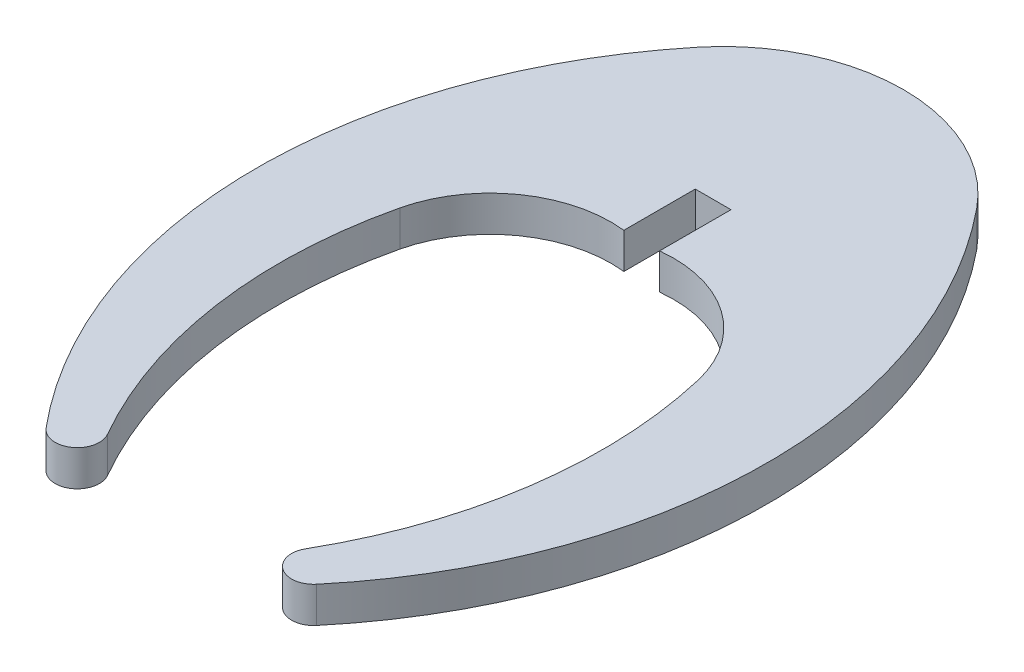
ISO-10303-21;
HEADER;
FILE_DESCRIPTION(('STEP AP214'),'2;1');
FILE_NAME('part.step','',(''),(''),'','','');
FILE_SCHEMA(('AUTOMOTIVE_DESIGN { 1 0 10303 214 1 1 1 1 }'));
ENDSEC;
DATA;
#1=APPLICATION_CONTEXT('core data for automotive mechanical design processes');
#2=APPLICATION_PROTOCOL_DEFINITION('international standard','automotive_design',2000,#1);
#3=PRODUCT_CONTEXT('',#1,'mechanical');
#4=PRODUCT('Part','Part','',(#3));
#5=PRODUCT_RELATED_PRODUCT_CATEGORY('part','',(#4));
#6=PRODUCT_DEFINITION_FORMATION('','',#4);
#7=PRODUCT_DEFINITION_CONTEXT('part definition',#1,'design');
#8=PRODUCT_DEFINITION('design','',#6,#7);
#9=PRODUCT_DEFINITION_SHAPE('','',#8);
#10=(LENGTH_UNIT() NAMED_UNIT(*) SI_UNIT(.MILLI.,.METRE.));
#11=(NAMED_UNIT(*) PLANE_ANGLE_UNIT() SI_UNIT($,.RADIAN.));
#12=(NAMED_UNIT(*) SI_UNIT($,.STERADIAN.) SOLID_ANGLE_UNIT());
#13=UNCERTAINTY_MEASURE_WITH_UNIT(LENGTH_MEASURE(1.E-05),#10,'distance_accuracy_value','');
#14=(GEOMETRIC_REPRESENTATION_CONTEXT(3) GLOBAL_UNCERTAINTY_ASSIGNED_CONTEXT((#13)) GLOBAL_UNIT_ASSIGNED_CONTEXT((#10,
#11,#12)) REPRESENTATION_CONTEXT('',''));
#15=CARTESIAN_POINT('',(0.,0.,0.));
#16=DIRECTION('',(0.,0.,1.));
#17=DIRECTION('',(1.,0.,0.));
#18=AXIS2_PLACEMENT_3D('',#15,#16,#17);
#19=CARTESIAN_POINT('',(-41923.310631,3.,-18307.5707099999));
#20=DIRECTION('',(-0.999999951477443,0.,0.000311520644661001));
#21=DIRECTION('',(0.000311520644661001,0.,0.999999951477443));
#22=AXIS2_PLACEMENT_3D('',#19,#20,#21);
#23=PLANE('',#22);
#24=DIRECTION('',(-0.000311520644661001,0.,-0.999999951477443));
#25=VECTOR('',#24,1.);
#26=CARTESIAN_POINT('',(-41923.310631,0.,-18307.5707099999));
#27=LINE('',#26,#25);
#28=CARTESIAN_POINT('',(-41923.310631,0.,-18307.5707099999));
#29=VERTEX_POINT('',#28);
#30=CARTESIAN_POINT('',(-41923.3125,0.,-18313.570312));
#31=VERTEX_POINT('',#30);
#32=EDGE_CURVE('E155',#29,#31,#27,.T.);
#33=ORIENTED_EDGE('',*,*,#32,.T.);
#34=DIRECTION('',(0.,-1.,0.));
#35=VECTOR('',#34,1.);
#36=CARTESIAN_POINT('',(-41923.3125,3.,-18313.570312));
#37=LINE('',#36,#35);
#38=CARTESIAN_POINT('',(-41923.3125,3.,-18313.570312));
#39=VERTEX_POINT('',#38);
#40=EDGE_CURVE('E11',#39,#31,#37,.T.);
#41=ORIENTED_EDGE('',*,*,#40,.F.);
#42=DIRECTION('',(-0.000311520644661001,0.,-0.999999951477443));
#43=VECTOR('',#42,1.);
#44=CARTESIAN_POINT('',(-41923.310631,3.,-18307.5707099999));
#45=LINE('',#44,#43);
#46=CARTESIAN_POINT('',(-41923.310631,3.,-18307.5707099999));
#47=VERTEX_POINT('',#46);
#48=EDGE_CURVE('E177',#47,#39,#45,.T.);
#49=ORIENTED_EDGE('',*,*,#48,.F.);
#50=DIRECTION('',(0.,-1.,0.));
#51=VECTOR('',#50,1.);
#52=CARTESIAN_POINT('',(-41923.310631,3.,-18307.5707099999));
#53=LINE('',#52,#51);
#54=EDGE_CURVE('E151',#47,#29,#53,.T.);
#55=ORIENTED_EDGE('',*,*,#54,.T.);
#56=EDGE_LOOP('',(#33,#41,#49,#55));
#57=FACE_BOUND('',#56,.T.);
#58=ADVANCED_FACE('F35',(#57),#23,.F.);
#59=CARTESIAN_POINT('',(-41923.3125,3.,-18313.570312));
#60=DIRECTION('',(0.000650153362123656,0.,-0.999999788650281));
#61=DIRECTION('',(-0.999999788650281,0.,-0.000650153362123656));
#62=AXIS2_PLACEMENT_3D('',#59,#60,#61);
#63=PLANE('',#62);
#64=DIRECTION('',(0.99999978865028,0.,0.000650153362123656));
#65=VECTOR('',#64,1.);
#66=CARTESIAN_POINT('',(-41923.3125,0.,-18313.570312));
#67=LINE('',#66,#65);
#68=CARTESIAN_POINT('',(-41920.308594,0.,-18313.568359));
#69=VERTEX_POINT('',#68);
#70=EDGE_CURVE('E158',#31,#69,#67,.T.);
#71=ORIENTED_EDGE('',*,*,#70,.T.);
#72=DIRECTION('',(0.,-1.,0.));
#73=VECTOR('',#72,1.);
#74=CARTESIAN_POINT('',(-41920.308594,3.,-18313.568359));
#75=LINE('',#74,#73);
#76=CARTESIAN_POINT('',(-41920.308594,3.,-18313.568359));
#77=VERTEX_POINT('',#76);
#78=EDGE_CURVE('E43',#77,#69,#75,.T.);
#79=ORIENTED_EDGE('',*,*,#78,.F.);
#80=DIRECTION('',(0.99999978865028,0.,0.000650153362123656));
#81=VECTOR('',#80,1.);
#82=CARTESIAN_POINT('',(-41923.3125,3.,-18313.570312));
#83=LINE('',#82,#81);
#84=EDGE_CURVE('E106',#39,#77,#83,.T.);
#85=ORIENTED_EDGE('',*,*,#84,.F.);
#86=ORIENTED_EDGE('',*,*,#40,.T.);
#87=EDGE_LOOP('',(#71,#79,#85,#86));
#88=FACE_BOUND('',#87,.T.);
#89=ADVANCED_FACE('F255',(#88),#63,.F.);
#90=CARTESIAN_POINT('',(-41920.308594,3.,-18313.568359));
#91=DIRECTION('',(0.999999787685049,0.,0.00065163629143758));
#92=DIRECTION('',(0.00065163629143758,0.,-0.999999787685049));
#93=AXIS2_PLACEMENT_3D('',#90,#91,#92);
#94=PLANE('',#93);
#95=DIRECTION('',(-0.00065163629143758,0.,0.999999787685049));
#96=VECTOR('',#95,1.);
#97=CARTESIAN_POINT('',(-41920.308594,0.,-18313.568359));
#98=LINE('',#97,#96);
#99=CARTESIAN_POINT('',(-41920.3125,0.,-18307.574219));
#100=VERTEX_POINT('',#99);
#101=EDGE_CURVE('E160',#69,#100,#98,.T.);
#102=ORIENTED_EDGE('',*,*,#101,.T.);
#103=DIRECTION('',(0.,-1.,0.));
#104=VECTOR('',#103,1.);
#105=CARTESIAN_POINT('',(-41920.3125,3.,-18307.574219));
#106=LINE('',#105,#104);
#107=CARTESIAN_POINT('',(-41920.3125,3.,-18307.574219));
#108=VERTEX_POINT('',#107);
#109=EDGE_CURVE('E196',#108,#100,#106,.T.);
#110=ORIENTED_EDGE('',*,*,#109,.F.);
#111=DIRECTION('',(-0.00065163629143758,0.,0.999999787685049));
#112=VECTOR('',#111,1.);
#113=CARTESIAN_POINT('',(-41920.308594,3.,-18313.568359));
#114=LINE('',#113,#112);
#115=EDGE_CURVE('E204',#77,#108,#114,.T.);
#116=ORIENTED_EDGE('',*,*,#115,.F.);
#117=ORIENTED_EDGE('',*,*,#78,.T.);
#118=EDGE_LOOP('',(#102,#110,#116,#117));
#119=FACE_BOUND('',#118,.T.);
#120=ADVANCED_FACE('F202',(#119),#94,.F.);
#121=CARTESIAN_POINT('',(-41919.1911014166,3.,-18297.4693434059));
#122=DIRECTION('',(0.,-1.,0.));
#123=DIRECTION('',(0.,0.,-1.));
#124=AXIS2_PLACEMENT_3D('',#121,#122,#123);
#125=CYLINDRICAL_SURFACE('',#124,10.1669093413984);
#126=CARTESIAN_POINT('',(-41919.1911014166,0.,-18297.4693434059));
#127=DIRECTION('',(0.,-1.,0.));
#128=DIRECTION('',(0.,0.,1.));
#129=AXIS2_PLACEMENT_3D('',#126,#127,#128);
#130=CIRCLE('',#129,10.1669093413984);
#131=CARTESIAN_POINT('',(-41909.2904880001,0.,-18299.781031));
#132=VERTEX_POINT('',#131);
#133=EDGE_CURVE('E162',#100,#132,#130,.T.);
#134=ORIENTED_EDGE('',*,*,#133,.T.);
#135=DIRECTION('',(0.,-1.,0.));
#136=VECTOR('',#135,1.);
#137=CARTESIAN_POINT('',(-41909.2904880001,3.,-18299.781031));
#138=LINE('',#137,#136);
#139=CARTESIAN_POINT('',(-41909.2904880001,3.,-18299.781031));
#140=VERTEX_POINT('',#139);
#141=EDGE_CURVE('E193',#140,#132,#138,.T.);
#142=ORIENTED_EDGE('',*,*,#141,.F.);
#143=CARTESIAN_POINT('',(-41919.1911014166,3.,-18297.4693434059));
#144=DIRECTION('',(0.,-1.,0.));
#145=DIRECTION('',(0.,0.,1.));
#146=AXIS2_PLACEMENT_3D('',#143,#144,#145);
#147=CIRCLE('',#146,10.1669093413984);
#148=EDGE_CURVE('E222',#108,#140,#147,.T.);
#149=ORIENTED_EDGE('',*,*,#148,.F.);
#150=ORIENTED_EDGE('',*,*,#109,.T.);
#151=EDGE_LOOP('',(#134,#142,#149,#150));
#152=FACE_BOUND('',#151,.T.);
#153=ADVANCED_FACE('F213',(#152),#125,.F.);
#154=CARTESIAN_POINT('',(-41947.8406722226,3.,-18290.7599826209));
#155=DIRECTION('',(0.,-1.,0.));
#156=DIRECTION('',(0.,0.,-1.));
#157=AXIS2_PLACEMENT_3D('',#154,#155,#156);
#158=CYLINDRICAL_SURFACE('',#157,39.5916154942953);
#159=CARTESIAN_POINT('',(-41947.8406722226,0.,-18290.7599826209));
#160=DIRECTION('',(0.,-1.,0.));
#161=DIRECTION('',(0.,0.,1.));
#162=AXIS2_PLACEMENT_3D('',#159,#160,#161);
#163=CIRCLE('',#162,39.5916154942953);
#164=CARTESIAN_POINT('',(-41913.5091370001,0.,-18271.040913));
#165=VERTEX_POINT('',#164);
#166=EDGE_CURVE('E164',#132,#165,#163,.T.);
#167=ORIENTED_EDGE('',*,*,#166,.T.);
#168=DIRECTION('',(0.,-1.,0.));
#169=VECTOR('',#168,1.);
#170=CARTESIAN_POINT('',(-41913.5091370001,3.,-18271.040913));
#171=LINE('',#170,#169);
#172=CARTESIAN_POINT('',(-41913.5091370001,3.,-18271.040913));
#173=VERTEX_POINT('',#172);
#174=EDGE_CURVE('E190',#173,#165,#171,.T.);
#175=ORIENTED_EDGE('',*,*,#174,.F.);
#176=CARTESIAN_POINT('',(-41947.8406722226,3.,-18290.7599826209));
#177=DIRECTION('',(0.,-1.,0.));
#178=DIRECTION('',(0.,0.,1.));
#179=AXIS2_PLACEMENT_3D('',#176,#177,#178);
#180=CIRCLE('',#179,39.5916154942953);
#181=EDGE_CURVE('E219',#140,#173,#180,.T.);
#182=ORIENTED_EDGE('',*,*,#181,.F.);
#183=ORIENTED_EDGE('',*,*,#141,.T.);
#184=EDGE_LOOP('',(#167,#175,#182,#183));
#185=FACE_BOUND('',#184,.T.);
#186=ADVANCED_FACE('F217',(#185),#158,.F.);
#187=CARTESIAN_POINT('',(-41911.8973565505,3.,-18270.1164332687));
#188=DIRECTION('',(0.,-1.,0.));
#189=DIRECTION('',(0.,0.,-1.));
#190=AXIS2_PLACEMENT_3D('',#187,#188,#189);
#191=CYLINDRICAL_SURFACE('',#190,1.85809014620008);
#192=CARTESIAN_POINT('',(-41911.8973565505,0.,-18270.1164332687));
#193=DIRECTION('',(0.,1.,0.));
#194=DIRECTION('',(0.,0.,1.));
#195=AXIS2_PLACEMENT_3D('',#192,#193,#194);
#196=CIRCLE('',#195,1.85809014620008);
#197=CARTESIAN_POINT('',(-41910.473192,0.,-18268.923012));
#198=VERTEX_POINT('',#197);
#199=EDGE_CURVE('E166',#165,#198,#196,.T.);
#200=ORIENTED_EDGE('',*,*,#199,.T.);
#201=DIRECTION('',(0.,-1.,0.));
#202=VECTOR('',#201,1.);
#203=CARTESIAN_POINT('',(-41910.473192,3.,-18268.923012));
#204=LINE('',#203,#202);
#205=CARTESIAN_POINT('',(-41910.473192,3.,-18268.923012));
#206=VERTEX_POINT('',#205);
#207=EDGE_CURVE('E187',#206,#198,#204,.T.);
#208=ORIENTED_EDGE('',*,*,#207,.F.);
#209=CARTESIAN_POINT('',(-41911.8973565505,3.,-18270.1164332687));
#210=DIRECTION('',(0.,1.,0.));
#211=DIRECTION('',(0.,0.,1.));
#212=AXIS2_PLACEMENT_3D('',#209,#210,#211);
#213=CIRCLE('',#212,1.85809014620008);
#214=EDGE_CURVE('E221',#173,#206,#213,.T.);
#215=ORIENTED_EDGE('',*,*,#214,.F.);
#216=ORIENTED_EDGE('',*,*,#174,.T.);
#217=EDGE_LOOP('',(#200,#208,#215,#216));
#218=FACE_BOUND('',#217,.T.);
#219=ADVANCED_FACE('F268',(#218),#191,.T.);
#220=CARTESIAN_POINT('',(-41943.5859328936,3.,-18296.6861208578));
#221=DIRECTION('',(0.,-1.,0.));
#222=DIRECTION('',(0.,0.,-1.));
#223=AXIS2_PLACEMENT_3D('',#220,#221,#222);
#224=CYLINDRICAL_SURFACE('',#223,43.2116167590956);
#225=CARTESIAN_POINT('',(-41943.5859328936,0.,-18296.6861208578));
#226=DIRECTION('',(0.,1.,0.));
#227=DIRECTION('',(0.,0.,1.));
#228=AXIS2_PLACEMENT_3D('',#225,#226,#227);
#229=CIRCLE('',#228,43.2116167590956);
#230=CARTESIAN_POINT('',(-41910.079274,0.,-18323.972521));
#231=VERTEX_POINT('',#230);
#232=EDGE_CURVE('E168',#198,#231,#229,.T.);
#233=ORIENTED_EDGE('',*,*,#232,.T.);
#234=DIRECTION('',(0.,-1.,0.));
#235=VECTOR('',#234,1.);
#236=CARTESIAN_POINT('',(-41910.079274,3.,-18323.972521));
#237=LINE('',#236,#235);
#238=CARTESIAN_POINT('',(-41910.079274,3.,-18323.972521));
#239=VERTEX_POINT('',#238);
#240=EDGE_CURVE('E184',#239,#231,#237,.T.);
#241=ORIENTED_EDGE('',*,*,#240,.F.);
#242=CARTESIAN_POINT('',(-41943.5859328936,3.,-18296.6861208578));
#243=DIRECTION('',(0.,1.,0.));
#244=DIRECTION('',(0.,0.,1.));
#245=AXIS2_PLACEMENT_3D('',#242,#243,#244);
#246=CIRCLE('',#245,43.2116167590956);
#247=EDGE_CURVE('E224',#206,#239,#246,.T.);
#248=ORIENTED_EDGE('',*,*,#247,.F.);
#249=ORIENTED_EDGE('',*,*,#207,.T.);
#250=EDGE_LOOP('',(#233,#241,#248,#249));
#251=FACE_BOUND('',#250,.T.);
#252=ADVANCED_FACE('F271',(#251),#224,.T.);
#253=CARTESIAN_POINT('',(-41921.8088364548,3.,-18314.4179691375));
#254=DIRECTION('',(0.,-1.,0.));
#255=DIRECTION('',(0.,0.,-1.));
#256=AXIS2_PLACEMENT_3D('',#253,#254,#255);
#257=CYLINDRICAL_SURFACE('',#256,15.1285193154019);
#258=CARTESIAN_POINT('',(-41921.8088364548,0.,-18314.4179691375));
#259=DIRECTION('',(0.,1.,0.));
#260=DIRECTION('',(0.,0.,1.));
#261=AXIS2_PLACEMENT_3D('',#258,#259,#260);
#262=CIRCLE('',#261,15.1285193154019);
#263=CARTESIAN_POINT('',(-41933.528271,0.,-18323.984941));
#264=VERTEX_POINT('',#263);
#265=EDGE_CURVE('E170',#231,#264,#262,.T.);
#266=ORIENTED_EDGE('',*,*,#265,.T.);
#267=DIRECTION('',(0.,-1.,0.));
#268=VECTOR('',#267,1.);
#269=CARTESIAN_POINT('',(-41933.528271,3.,-18323.984941));
#270=LINE('',#269,#268);
#271=CARTESIAN_POINT('',(-41933.528271,3.,-18323.984941));
#272=VERTEX_POINT('',#271);
#273=EDGE_CURVE('E181',#272,#264,#270,.T.);
#274=ORIENTED_EDGE('',*,*,#273,.F.);
#275=CARTESIAN_POINT('',(-41921.8088364548,3.,-18314.4179691375));
#276=DIRECTION('',(0.,1.,0.));
#277=DIRECTION('',(0.,0.,1.));
#278=AXIS2_PLACEMENT_3D('',#275,#276,#277);
#279=CIRCLE('',#278,15.1285193154019);
#280=EDGE_CURVE('E230',#239,#272,#279,.T.);
#281=ORIENTED_EDGE('',*,*,#280,.F.);
#282=ORIENTED_EDGE('',*,*,#240,.T.);
#283=EDGE_LOOP('',(#266,#274,#281,#282));
#284=FACE_BOUND('',#283,.T.);
#285=ADVANCED_FACE('F236',(#284),#257,.T.);
#286=CARTESIAN_POINT('',(-41900.0507753076,3.,-18296.6631295691));
#287=DIRECTION('',(0.,-1.,0.));
#288=DIRECTION('',(0.,0.,-1.));
#289=AXIS2_PLACEMENT_3D('',#286,#287,#288);
#290=CYLINDRICAL_SURFACE('',#289,43.2113885184947);
#291=CARTESIAN_POINT('',(-41900.0507753076,0.,-18296.6631295691));
#292=DIRECTION('',(0.,1.,0.));
#293=DIRECTION('',(0.,0.,1.));
#294=AXIS2_PLACEMENT_3D('',#291,#292,#293);
#295=CIRCLE('',#294,43.2113885184947);
#296=CARTESIAN_POINT('',(-41933.192194,0.,-18268.9346159999));
#297=VERTEX_POINT('',#296);
#298=EDGE_CURVE('E172',#264,#297,#295,.T.);
#299=ORIENTED_EDGE('',*,*,#298,.T.);
#300=DIRECTION('',(0.,-1.,0.));
#301=VECTOR('',#300,1.);
#302=CARTESIAN_POINT('',(-41933.192194,3.,-18268.9346159999));
#303=LINE('',#302,#301);
#304=CARTESIAN_POINT('',(-41933.192194,3.,-18268.9346159999));
#305=VERTEX_POINT('',#304);
#306=EDGE_CURVE('E146',#305,#297,#303,.T.);
#307=ORIENTED_EDGE('',*,*,#306,.F.);
#308=CARTESIAN_POINT('',(-41900.0507753076,3.,-18296.6631295691));
#309=DIRECTION('',(0.,1.,0.));
#310=DIRECTION('',(0.,0.,1.));
#311=AXIS2_PLACEMENT_3D('',#308,#309,#310);
#312=CIRCLE('',#311,43.2113885184947);
#313=EDGE_CURVE('E137',#272,#305,#312,.T.);
#314=ORIENTED_EDGE('',*,*,#313,.F.);
#315=ORIENTED_EDGE('',*,*,#273,.T.);
#316=EDGE_LOOP('',(#299,#307,#314,#315));
#317=FACE_BOUND('',#316,.T.);
#318=ADVANCED_FACE('F240',(#317),#290,.T.);
#319=CARTESIAN_POINT('',(-41931.7650409498,3.,-18270.1254058329));
#320=DIRECTION('',(0.,-1.,0.));
#321=DIRECTION('',(0.,0.,-1.));
#322=AXIS2_PLACEMENT_3D('',#319,#320,#321);
#323=CYLINDRICAL_SURFACE('',#322,1.85869477179344);
#324=CARTESIAN_POINT('',(-41931.7650409498,0.,-18270.1254058329));
#325=DIRECTION('',(0.,1.,0.));
#326=DIRECTION('',(0.,0.,1.));
#327=AXIS2_PLACEMENT_3D('',#324,#325,#326);
#328=CIRCLE('',#327,1.85869477179344);
#329=CARTESIAN_POINT('',(-41930.151273,0.,-18271.047631));
#330=VERTEX_POINT('',#329);
#331=EDGE_CURVE('E145',#297,#330,#328,.T.);
#332=ORIENTED_EDGE('',*,*,#331,.T.);
#333=DIRECTION('',(0.,-1.,0.));
#334=VECTOR('',#333,1.);
#335=CARTESIAN_POINT('',(-41930.151273,3.,-18271.047631));
#336=LINE('',#335,#334);
#337=CARTESIAN_POINT('',(-41930.151273,3.,-18271.047631));
#338=VERTEX_POINT('',#337);
#339=EDGE_CURVE('E142',#338,#330,#336,.T.);
#340=ORIENTED_EDGE('',*,*,#339,.F.);
#341=CARTESIAN_POINT('',(-41931.7650409498,3.,-18270.1254058329));
#342=DIRECTION('',(0.,1.,0.));
#343=DIRECTION('',(0.,0.,1.));
#344=AXIS2_PLACEMENT_3D('',#341,#342,#343);
#345=CIRCLE('',#344,1.85869477179344);
#346=EDGE_CURVE('E131',#305,#338,#345,.T.);
#347=ORIENTED_EDGE('',*,*,#346,.F.);
#348=ORIENTED_EDGE('',*,*,#306,.T.);
#349=EDGE_LOOP('',(#332,#340,#347,#348));
#350=FACE_BOUND('',#349,.T.);
#351=ADVANCED_FACE('F143',(#350),#323,.T.);
#352=CARTESIAN_POINT('',(-41895.8007405537,3.,-18290.7380037277));
#353=DIRECTION('',(0.,-1.,0.));
#354=DIRECTION('',(0.,0.,-1.));
#355=AXIS2_PLACEMENT_3D('',#352,#353,#354);
#356=CYLINDRICAL_SURFACE('',#355,39.5938108484674);
#357=CARTESIAN_POINT('',(-41895.8007405537,0.,-18290.7380037277));
#358=DIRECTION('',(0.,-1.,0.));
#359=DIRECTION('',(0.,0.,1.));
#360=AXIS2_PLACEMENT_3D('',#357,#358,#359);
#361=CIRCLE('',#360,39.5938108484674);
#362=CARTESIAN_POINT('',(-41934.344733,0.,-18299.795073));
#363=VERTEX_POINT('',#362);
#364=EDGE_CURVE('E92',#330,#363,#361,.T.);
#365=ORIENTED_EDGE('',*,*,#364,.T.);
#366=DIRECTION('',(0.,-1.,0.));
#367=VECTOR('',#366,1.);
#368=CARTESIAN_POINT('',(-41934.344733,3.,-18299.795073));
#369=LINE('',#368,#367);
#370=CARTESIAN_POINT('',(-41934.344733,3.,-18299.795073));
#371=VERTEX_POINT('',#370);
#372=EDGE_CURVE('E147',#371,#363,#369,.T.);
#373=ORIENTED_EDGE('',*,*,#372,.F.);
#374=CARTESIAN_POINT('',(-41895.8007405537,3.,-18290.7380037277));
#375=DIRECTION('',(0.,-1.,0.));
#376=DIRECTION('',(0.,0.,1.));
#377=AXIS2_PLACEMENT_3D('',#374,#375,#376);
#378=CIRCLE('',#377,39.5938108484674);
#379=EDGE_CURVE('E135',#338,#371,#378,.T.);
#380=ORIENTED_EDGE('',*,*,#379,.F.);
#381=ORIENTED_EDGE('',*,*,#339,.T.);
#382=EDGE_LOOP('',(#365,#373,#380,#381));
#383=FACE_BOUND('',#382,.T.);
#384=ADVANCED_FACE('F149',(#383),#356,.F.);
#385=CARTESIAN_POINT('',(-41924.4497449079,3.,-18297.4703323972));
#386=DIRECTION('',(0.,-1.,0.));
#387=DIRECTION('',(0.,0.,-1.));
#388=AXIS2_PLACEMENT_3D('',#385,#386,#387);
#389=CYLINDRICAL_SURFACE('',#388,10.1644088964009);
#390=CARTESIAN_POINT('',(-41924.4497449079,0.,-18297.4703323972));
#391=DIRECTION('',(0.,-1.,0.));
#392=DIRECTION('',(0.,0.,1.));
#393=AXIS2_PLACEMENT_3D('',#390,#391,#392);
#394=CIRCLE('',#393,10.1644088964009);
#395=EDGE_CURVE('E98',#363,#29,#394,.T.);
#396=ORIENTED_EDGE('',*,*,#395,.T.);
#397=ORIENTED_EDGE('',*,*,#54,.F.);
#398=CARTESIAN_POINT('',(-41924.4497449079,3.,-18297.4703323972));
#399=DIRECTION('',(0.,-1.,0.));
#400=DIRECTION('',(0.,0.,1.));
#401=AXIS2_PLACEMENT_3D('',#398,#399,#400);
#402=CIRCLE('',#401,10.1644088964009);
#403=EDGE_CURVE('E51',#371,#47,#402,.T.);
#404=ORIENTED_EDGE('',*,*,#403,.F.);
#405=ORIENTED_EDGE('',*,*,#372,.T.);
#406=EDGE_LOOP('',(#396,#397,#404,#405));
#407=FACE_BOUND('',#406,.T.);
#408=ADVANCED_FACE('F244',(#407),#389,.F.);
#409=CARTESIAN_POINT('',(-41919.1911014166,3.,-18297.4693434059));
#410=DIRECTION('',(0.,1.,0.));
#411=DIRECTION('',(0.,0.,1.));
#412=AXIS2_PLACEMENT_3D('',#409,#410,#411);
#413=PLANE('',#412);
#414=ORIENTED_EDGE('',*,*,#48,.T.);
#415=ORIENTED_EDGE('',*,*,#84,.T.);
#416=ORIENTED_EDGE('',*,*,#115,.T.);
#417=ORIENTED_EDGE('',*,*,#148,.T.);
#418=ORIENTED_EDGE('',*,*,#181,.T.);
#419=ORIENTED_EDGE('',*,*,#214,.T.);
#420=ORIENTED_EDGE('',*,*,#247,.T.);
#421=ORIENTED_EDGE('',*,*,#280,.T.);
#422=ORIENTED_EDGE('',*,*,#313,.T.);
#423=ORIENTED_EDGE('',*,*,#346,.T.);
#424=ORIENTED_EDGE('',*,*,#379,.T.);
#425=ORIENTED_EDGE('',*,*,#403,.T.);
#426=EDGE_LOOP('',(#414,#415,#416,#417,#418,#419,#420,#421,#422,#423,#424,#425));
#427=FACE_BOUND('',#426,.T.);
#428=ADVANCED_FACE('F133',(#427),#413,.T.);
#429=CARTESIAN_POINT('',(-41919.1911014166,0.,-18297.4693434059));
#430=DIRECTION('',(0.,1.,0.));
#431=DIRECTION('',(0.,0.,1.));
#432=AXIS2_PLACEMENT_3D('',#429,#430,#431);
#433=PLANE('',#432);
#434=ORIENTED_EDGE('',*,*,#32,.F.);
#435=ORIENTED_EDGE('',*,*,#395,.F.);
#436=ORIENTED_EDGE('',*,*,#364,.F.);
#437=ORIENTED_EDGE('',*,*,#331,.F.);
#438=ORIENTED_EDGE('',*,*,#298,.F.);
#439=ORIENTED_EDGE('',*,*,#265,.F.);
#440=ORIENTED_EDGE('',*,*,#232,.F.);
#441=ORIENTED_EDGE('',*,*,#199,.F.);
#442=ORIENTED_EDGE('',*,*,#166,.F.);
#443=ORIENTED_EDGE('',*,*,#133,.F.);
#444=ORIENTED_EDGE('',*,*,#101,.F.);
#445=ORIENTED_EDGE('',*,*,#70,.F.);
#446=EDGE_LOOP('',(#434,#435,#436,#437,#438,#439,#440,#441,#442,#443,#444,#445));
#447=FACE_BOUND('',#446,.T.);
#448=ADVANCED_FACE('F208',(#447),#433,.F.);
#449=CLOSED_SHELL('',(#58,#89,#120,#153,#186,#219,#252,#285,#318,#351,#384,#408,#428,#448));
#450=MANIFOLD_SOLID_BREP('B2',#449);
#451=ADVANCED_BREP_SHAPE_REPRESENTATION('',(#18,#450),#14);
#452=SHAPE_DEFINITION_REPRESENTATION(#9,#451);
ENDSEC;
END-ISO-10303-21;
